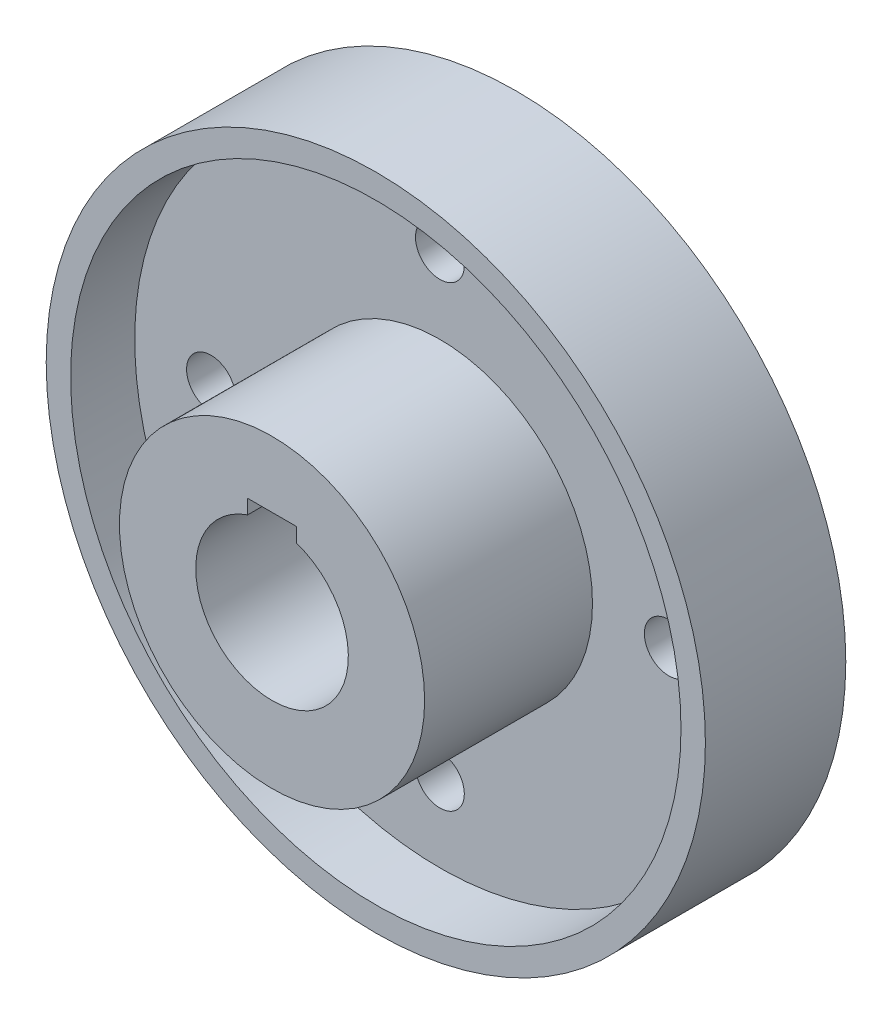
ISO-10303-21;
HEADER;
FILE_DESCRIPTION(('STEP AP214'),'2;1');
FILE_NAME('part.step','',(''),(''),'','','');
FILE_SCHEMA(('AUTOMOTIVE_DESIGN { 1 0 10303 214 1 1 1 1 }'));
ENDSEC;
DATA;
#1=APPLICATION_CONTEXT('core data for automotive mechanical design processes');
#2=APPLICATION_PROTOCOL_DEFINITION('international standard','automotive_design',2000,#1);
#3=PRODUCT_CONTEXT('',#1,'mechanical');
#4=PRODUCT('Part','Part','',(#3));
#5=PRODUCT_RELATED_PRODUCT_CATEGORY('part','',(#4));
#6=PRODUCT_DEFINITION_FORMATION('','',#4);
#7=PRODUCT_DEFINITION_CONTEXT('part definition',#1,'design');
#8=PRODUCT_DEFINITION('design','',#6,#7);
#9=PRODUCT_DEFINITION_SHAPE('','',#8);
#10=(LENGTH_UNIT() NAMED_UNIT(*) SI_UNIT(.MILLI.,.METRE.));
#11=(NAMED_UNIT(*) PLANE_ANGLE_UNIT() SI_UNIT($,.RADIAN.));
#12=(NAMED_UNIT(*) SI_UNIT($,.STERADIAN.) SOLID_ANGLE_UNIT());
#13=UNCERTAINTY_MEASURE_WITH_UNIT(LENGTH_MEASURE(1.E-05),#10,'distance_accuracy_value','');
#14=(GEOMETRIC_REPRESENTATION_CONTEXT(3) GLOBAL_UNCERTAINTY_ASSIGNED_CONTEXT((#13)) GLOBAL_UNIT_ASSIGNED_CONTEXT((#10,
#11,#12)) REPRESENTATION_CONTEXT('',''));
#15=CARTESIAN_POINT('',(0.,0.,0.));
#16=DIRECTION('',(0.,0.,1.));
#17=DIRECTION('',(1.,0.,0.));
#18=AXIS2_PLACEMENT_3D('',#15,#16,#17);
#19=CARTESIAN_POINT('',(0.,75.,46.));
#20=DIRECTION('',(0.,0.,-1.));
#21=DIRECTION('',(-1.,0.,0.));
#22=AXIS2_PLACEMENT_3D('',#19,#20,#21);
#23=CYLINDRICAL_SURFACE('',#22,8.);
#24=CARTESIAN_POINT('',(0.,75.,0.));
#25=DIRECTION('',(0.,0.,-1.));
#26=DIRECTION('',(-1.,0.,0.));
#27=AXIS2_PLACEMENT_3D('',#24,#25,#26);
#28=CIRCLE('',#27,8.);
#29=CARTESIAN_POINT('',(-8.,75.,0.));
#30=VERTEX_POINT('',#29);
#31=EDGE_CURVE('E121',#30,#30,#28,.T.);
#32=ORIENTED_EDGE('',*,*,#31,.T.);
#33=EDGE_LOOP('',(#32));
#34=FACE_BOUND('',#33,.T.);
#35=CARTESIAN_POINT('',(0.,75.,25.));
#36=DIRECTION('',(0.,0.,1.));
#37=DIRECTION('',(1.,0.,0.));
#38=AXIS2_PLACEMENT_3D('',#35,#36,#37);
#39=CIRCLE('',#38,8.);
#40=CARTESIAN_POINT('',(8.,75.,25.));
#41=VERTEX_POINT('',#40);
#42=EDGE_CURVE('E101',#41,#41,#39,.F.);
#43=ORIENTED_EDGE('',*,*,#42,.F.);
#44=EDGE_LOOP('',(#43));
#45=FACE_BOUND('',#44,.T.);
#46=ADVANCED_FACE('F45',(#34,#45),#23,.F.);
#47=CARTESIAN_POINT('',(-75.0000000000021,2.11785093078989E-12,46.));
#48=DIRECTION('',(0.,0.,-1.));
#49=DIRECTION('',(-1.,0.,0.));
#50=AXIS2_PLACEMENT_3D('',#47,#48,#49);
#51=CYLINDRICAL_SURFACE('',#50,8.00000000000166);
#52=CARTESIAN_POINT('',(-75.0000000000021,2.11785093078989E-12,0.));
#53=DIRECTION('',(0.,0.,-1.));
#54=DIRECTION('',(-1.,0.,0.));
#55=AXIS2_PLACEMENT_3D('',#52,#53,#54);
#56=CIRCLE('',#55,8.00000000000166);
#57=CARTESIAN_POINT('',(-83.0000000000038,2.11785093078989E-12,0.));
#58=VERTEX_POINT('',#57);
#59=EDGE_CURVE('E118',#58,#58,#56,.T.);
#60=ORIENTED_EDGE('',*,*,#59,.T.);
#61=EDGE_LOOP('',(#60));
#62=FACE_BOUND('',#61,.T.);
#63=CARTESIAN_POINT('',(-75.0000000000021,2.11785093078989E-12,25.));
#64=DIRECTION('',(0.,0.,1.));
#65=DIRECTION('',(1.,0.,0.));
#66=AXIS2_PLACEMENT_3D('',#63,#64,#65);
#67=CIRCLE('',#66,8.00000000000166);
#68=CARTESIAN_POINT('',(-67.0000000000005,2.11785093078989E-12,25.));
#69=VERTEX_POINT('',#68);
#70=EDGE_CURVE('E228',#69,#69,#67,.F.);
#71=ORIENTED_EDGE('',*,*,#70,.F.);
#72=EDGE_LOOP('',(#71));
#73=FACE_BOUND('',#72,.T.);
#74=ADVANCED_FACE('F166',(#62,#73),#51,.F.);
#75=CARTESIAN_POINT('',(-4.23570186157978E-12,-75.,46.));
#76=DIRECTION('',(0.,0.,-1.));
#77=DIRECTION('',(-1.,0.,0.));
#78=AXIS2_PLACEMENT_3D('',#75,#76,#77);
#79=CYLINDRICAL_SURFACE('',#78,8.00000000000455);
#80=CARTESIAN_POINT('',(-4.23570186157978E-12,-75.,0.));
#81=DIRECTION('',(0.,0.,-1.));
#82=DIRECTION('',(-1.,0.,0.));
#83=AXIS2_PLACEMENT_3D('',#80,#81,#82);
#84=CIRCLE('',#83,8.00000000000455);
#85=CARTESIAN_POINT('',(-8.00000000000879,-75.,0.));
#86=VERTEX_POINT('',#85);
#87=EDGE_CURVE('E115',#86,#86,#84,.T.);
#88=ORIENTED_EDGE('',*,*,#87,.T.);
#89=EDGE_LOOP('',(#88));
#90=FACE_BOUND('',#89,.T.);
#91=CARTESIAN_POINT('',(-4.23570186157978E-12,-75.,25.));
#92=DIRECTION('',(0.,0.,1.));
#93=DIRECTION('',(1.,0.,0.));
#94=AXIS2_PLACEMENT_3D('',#91,#92,#93);
#95=CIRCLE('',#94,8.00000000000455);
#96=CARTESIAN_POINT('',(8.00000000000032,-75.,25.));
#97=VERTEX_POINT('',#96);
#98=EDGE_CURVE('E225',#97,#97,#95,.F.);
#99=ORIENTED_EDGE('',*,*,#98,.F.);
#100=EDGE_LOOP('',(#99));
#101=FACE_BOUND('',#100,.T.);
#102=ADVANCED_FACE('F172',(#90,#101),#79,.F.);
#103=CARTESIAN_POINT('',(74.9999999999979,-2.1270357817835E-12,46.));
#104=DIRECTION('',(0.,0.,-1.));
#105=DIRECTION('',(-1.,0.,0.));
#106=AXIS2_PLACEMENT_3D('',#103,#104,#105);
#107=CYLINDRICAL_SURFACE('',#106,8.00000000000341);
#108=CARTESIAN_POINT('',(74.9999999999979,-2.1270357817835E-12,0.));
#109=DIRECTION('',(0.,0.,-1.));
#110=DIRECTION('',(-1.,0.,0.));
#111=AXIS2_PLACEMENT_3D('',#108,#109,#110);
#112=CIRCLE('',#111,8.00000000000341);
#113=CARTESIAN_POINT('',(66.9999999999945,-2.1270357817835E-12,0.));
#114=VERTEX_POINT('',#113);
#115=EDGE_CURVE('E112',#114,#114,#112,.T.);
#116=ORIENTED_EDGE('',*,*,#115,.T.);
#117=EDGE_LOOP('',(#116));
#118=FACE_BOUND('',#117,.T.);
#119=CARTESIAN_POINT('',(74.9999999999979,-2.1270357817835E-12,25.));
#120=DIRECTION('',(0.,0.,1.));
#121=DIRECTION('',(1.,0.,0.));
#122=AXIS2_PLACEMENT_3D('',#119,#120,#121);
#123=CIRCLE('',#122,8.00000000000341);
#124=CARTESIAN_POINT('',(83.0000000000013,-2.1270357817835E-12,25.));
#125=VERTEX_POINT('',#124);
#126=EDGE_CURVE('E50',#125,#125,#123,.F.);
#127=ORIENTED_EDGE('',*,*,#126,.F.);
#128=EDGE_LOOP('',(#127));
#129=FACE_BOUND('',#128,.T.);
#130=ADVANCED_FACE('F205',(#118,#129),#107,.F.);
#131=CARTESIAN_POINT('',(0.,0.,0.));
#132=DIRECTION('',(0.,0.,1.));
#133=DIRECTION('',(1.,0.,0.));
#134=AXIS2_PLACEMENT_3D('',#131,#132,#133);
#135=PLANE('',#134);
#136=CARTESIAN_POINT('',(0.,0.,0.));
#137=DIRECTION('',(0.,0.,-1.));
#138=DIRECTION('',(-1.,0.,0.));
#139=AXIS2_PLACEMENT_3D('',#136,#137,#138);
#140=CIRCLE('',#139,108.);
#141=CARTESIAN_POINT('',(-108.,0.,0.));
#142=VERTEX_POINT('',#141);
#143=EDGE_CURVE('E124',#142,#142,#140,.T.);
#144=ORIENTED_EDGE('',*,*,#143,.T.);
#145=EDGE_LOOP('',(#144));
#146=FACE_BOUND('',#145,.T.);
#147=ORIENTED_EDGE('',*,*,#31,.F.);
#148=EDGE_LOOP('',(#147));
#149=FACE_BOUND('',#148,.T.);
#150=ORIENTED_EDGE('',*,*,#59,.F.);
#151=EDGE_LOOP('',(#150));
#152=FACE_BOUND('',#151,.T.);
#153=ORIENTED_EDGE('',*,*,#87,.F.);
#154=EDGE_LOOP('',(#153));
#155=FACE_BOUND('',#154,.T.);
#156=ORIENTED_EDGE('',*,*,#115,.F.);
#157=EDGE_LOOP('',(#156));
#158=FACE_BOUND('',#157,.T.);
#159=CARTESIAN_POINT('',(0.,0.,0.));
#160=DIRECTION('',(0.,0.,1.));
#161=DIRECTION('',(1.,0.,0.));
#162=AXIS2_PLACEMENT_3D('',#159,#160,#161);
#163=CIRCLE('',#162,50.);
#164=CARTESIAN_POINT('',(50.,0.,0.));
#165=VERTEX_POINT('',#164);
#166=EDGE_CURVE('E144',#165,#165,#163,.F.);
#167=ORIENTED_EDGE('',*,*,#166,.F.);
#168=EDGE_LOOP('',(#167));
#169=FACE_BOUND('',#168,.T.);
#170=ADVANCED_FACE('F203',(#146,#149,#152,#155,#158,#169),#135,.F.);
#171=CARTESIAN_POINT('',(0.,0.,80.));
#172=DIRECTION('',(0.,0.,-1.));
#173=DIRECTION('',(-1.,0.,0.));
#174=AXIS2_PLACEMENT_3D('',#171,#172,#173);
#175=CYLINDRICAL_SURFACE('',#174,50.);
#176=CARTESIAN_POINT('',(0.,0.,80.));
#177=DIRECTION('',(0.,0.,1.));
#178=DIRECTION('',(1.,0.,0.));
#179=AXIS2_PLACEMENT_3D('',#176,#177,#178);
#180=CIRCLE('',#179,50.);
#181=CARTESIAN_POINT('',(50.,0.,80.));
#182=VERTEX_POINT('',#181);
#183=EDGE_CURVE('E141',#182,#182,#180,.T.);
#184=ORIENTED_EDGE('',*,*,#183,.F.);
#185=EDGE_LOOP('',(#184));
#186=FACE_BOUND('',#185,.T.);
#187=CARTESIAN_POINT('',(0.,0.,25.));
#188=DIRECTION('',(0.,0.,1.));
#189=DIRECTION('',(1.,0.,0.));
#190=AXIS2_PLACEMENT_3D('',#187,#188,#189);
#191=CIRCLE('',#190,50.);
#192=CARTESIAN_POINT('',(50.,0.,25.));
#193=VERTEX_POINT('',#192);
#194=EDGE_CURVE('E216',#193,#193,#191,.T.);
#195=ORIENTED_EDGE('',*,*,#194,.T.);
#196=EDGE_LOOP('',(#195));
#197=FACE_BOUND('',#196,.T.);
#198=ADVANCED_FACE('F201',(#186,#197),#175,.T.);
#199=CARTESIAN_POINT('',(0.,0.,80.));
#200=DIRECTION('',(0.,0.,1.));
#201=DIRECTION('',(1.,0.,0.));
#202=AXIS2_PLACEMENT_3D('',#199,#200,#201);
#203=PLANE('',#202);
#204=ORIENTED_EDGE('',*,*,#183,.T.);
#205=EDGE_LOOP('',(#204));
#206=FACE_BOUND('',#205,.T.);
#207=DIRECTION('',(0.,1.,0.));
#208=VECTOR('',#207,1.);
#209=CARTESIAN_POINT('',(8.,28.4,80.));
#210=LINE('',#209,#208);
#211=CARTESIAN_POINT('',(8.,23.685438564654,80.));
#212=VERTEX_POINT('',#211);
#213=CARTESIAN_POINT('',(8.,28.4,80.));
#214=VERTEX_POINT('',#213);
#215=EDGE_CURVE('E132',#212,#214,#210,.T.);
#216=ORIENTED_EDGE('',*,*,#215,.F.);
#217=CARTESIAN_POINT('',(0.,0.,80.));
#218=DIRECTION('',(0.,0.,1.));
#219=DIRECTION('',(1.,0.,0.));
#220=AXIS2_PLACEMENT_3D('',#217,#218,#219);
#221=CIRCLE('',#220,25.);
#222=CARTESIAN_POINT('',(-8.,23.685438564654,80.));
#223=VERTEX_POINT('',#222);
#224=EDGE_CURVE('E128',#223,#212,#221,.T.);
#225=ORIENTED_EDGE('',*,*,#224,.F.);
#226=DIRECTION('',(0.,-1.,0.));
#227=VECTOR('',#226,1.);
#228=CARTESIAN_POINT('',(-8.,28.4,80.));
#229=LINE('',#228,#227);
#230=CARTESIAN_POINT('',(-8.,28.4,80.));
#231=VERTEX_POINT('',#230);
#232=EDGE_CURVE('E67',#231,#223,#229,.T.);
#233=ORIENTED_EDGE('',*,*,#232,.F.);
#234=DIRECTION('',(-1.,0.,0.));
#235=VECTOR('',#234,1.);
#236=CARTESIAN_POINT('',(-8.,28.4,80.));
#237=LINE('',#236,#235);
#238=EDGE_CURVE('E134',#214,#231,#237,.T.);
#239=ORIENTED_EDGE('',*,*,#238,.F.);
#240=EDGE_LOOP('',(#216,#225,#233,#239));
#241=FACE_BOUND('',#240,.T.);
#242=ADVANCED_FACE('F198',(#206,#241),#203,.T.);
#243=CARTESIAN_POINT('',(0.,0.,80.));
#244=DIRECTION('',(0.,0.,-1.));
#245=DIRECTION('',(-1.,0.,0.));
#246=AXIS2_PLACEMENT_3D('',#243,#244,#245);
#247=CYLINDRICAL_SURFACE('',#246,25.);
#248=DIRECTION('',(0.,0.,-1.));
#249=VECTOR('',#248,1.);
#250=CARTESIAN_POINT('',(8.,23.685438564654,80.));
#251=LINE('',#250,#249);
#252=CARTESIAN_POINT('',(8.,23.685438564654,-5.));
#253=VERTEX_POINT('',#252);
#254=EDGE_CURVE('E97',#212,#253,#251,.T.);
#255=ORIENTED_EDGE('',*,*,#254,.T.);
#256=CARTESIAN_POINT('',(0.,0.,-5.));
#257=DIRECTION('',(0.,0.,-1.));
#258=DIRECTION('',(-1.,0.,0.));
#259=AXIS2_PLACEMENT_3D('',#256,#257,#258);
#260=CIRCLE('',#259,25.);
#261=CARTESIAN_POINT('',(-8.,23.685438564654,-5.));
#262=VERTEX_POINT('',#261);
#263=EDGE_CURVE('E94',#253,#262,#260,.T.);
#264=ORIENTED_EDGE('',*,*,#263,.T.);
#265=DIRECTION('',(0.,0.,-1.));
#266=VECTOR('',#265,1.);
#267=CARTESIAN_POINT('',(-8.,23.685438564654,80.));
#268=LINE('',#267,#266);
#269=EDGE_CURVE('E84',#223,#262,#268,.T.);
#270=ORIENTED_EDGE('',*,*,#269,.F.);
#271=ORIENTED_EDGE('',*,*,#224,.T.);
#272=EDGE_LOOP('',(#255,#264,#270,#271));
#273=FACE_BOUND('',#272,.T.);
#274=ADVANCED_FACE('F95',(#273),#247,.F.);
#275=CARTESIAN_POINT('',(8.,28.4,80.));
#276=DIRECTION('',(-1.,0.,0.));
#277=DIRECTION('',(0.,-1.,0.));
#278=AXIS2_PLACEMENT_3D('',#275,#276,#277);
#279=PLANE('',#278);
#280=DIRECTION('',(0.,0.,-1.));
#281=VECTOR('',#280,1.);
#282=CARTESIAN_POINT('',(8.,28.4,80.));
#283=LINE('',#282,#281);
#284=CARTESIAN_POINT('',(8.,28.4,-5.));
#285=VERTEX_POINT('',#284);
#286=EDGE_CURVE('E138',#214,#285,#283,.T.);
#287=ORIENTED_EDGE('',*,*,#286,.T.);
#288=DIRECTION('',(0.,-1.,0.));
#289=VECTOR('',#288,1.);
#290=CARTESIAN_POINT('',(8.,23.685438564654,-5.));
#291=LINE('',#290,#289);
#292=EDGE_CURVE('E107',#285,#253,#291,.T.);
#293=ORIENTED_EDGE('',*,*,#292,.T.);
#294=ORIENTED_EDGE('',*,*,#254,.F.);
#295=ORIENTED_EDGE('',*,*,#215,.T.);
#296=EDGE_LOOP('',(#287,#293,#294,#295));
#297=FACE_BOUND('',#296,.T.);
#298=ADVANCED_FACE('F191',(#297),#279,.T.);
#299=CARTESIAN_POINT('',(-8.,28.4,80.));
#300=DIRECTION('',(0.,-1.,0.));
#301=DIRECTION('',(0.,0.,-1.));
#302=AXIS2_PLACEMENT_3D('',#299,#300,#301);
#303=PLANE('',#302);
#304=DIRECTION('',(0.,0.,-1.));
#305=VECTOR('',#304,1.);
#306=CARTESIAN_POINT('',(-8.,28.4,80.));
#307=LINE('',#306,#305);
#308=CARTESIAN_POINT('',(-8.,28.4,-5.));
#309=VERTEX_POINT('',#308);
#310=EDGE_CURVE('E62',#231,#309,#307,.T.);
#311=ORIENTED_EDGE('',*,*,#310,.T.);
#312=DIRECTION('',(1.,0.,0.));
#313=VECTOR('',#312,1.);
#314=CARTESIAN_POINT('',(8.,28.4,-5.));
#315=LINE('',#314,#313);
#316=EDGE_CURVE('E105',#309,#285,#315,.T.);
#317=ORIENTED_EDGE('',*,*,#316,.T.);
#318=ORIENTED_EDGE('',*,*,#286,.F.);
#319=ORIENTED_EDGE('',*,*,#238,.T.);
#320=EDGE_LOOP('',(#311,#317,#318,#319));
#321=FACE_BOUND('',#320,.T.);
#322=ADVANCED_FACE('F188',(#321),#303,.T.);
#323=CARTESIAN_POINT('',(-8.,28.4,80.));
#324=DIRECTION('',(1.,0.,0.));
#325=DIRECTION('',(0.,0.,-1.));
#326=AXIS2_PLACEMENT_3D('',#323,#324,#325);
#327=PLANE('',#326);
#328=ORIENTED_EDGE('',*,*,#269,.T.);
#329=DIRECTION('',(0.,1.,0.));
#330=VECTOR('',#329,1.);
#331=CARTESIAN_POINT('',(-8.,28.4,-5.));
#332=LINE('',#331,#330);
#333=EDGE_CURVE('E88',#262,#309,#332,.T.);
#334=ORIENTED_EDGE('',*,*,#333,.T.);
#335=ORIENTED_EDGE('',*,*,#310,.F.);
#336=ORIENTED_EDGE('',*,*,#232,.T.);
#337=EDGE_LOOP('',(#328,#334,#335,#336));
#338=FACE_BOUND('',#337,.T.);
#339=ADVANCED_FACE('F86',(#338),#327,.T.);
#340=CARTESIAN_POINT('',(0.,0.,46.));
#341=DIRECTION('',(0.,0.,-1.));
#342=DIRECTION('',(-1.,0.,0.));
#343=AXIS2_PLACEMENT_3D('',#340,#341,#342);
#344=CYLINDRICAL_SURFACE('',#343,108.);
#345=CARTESIAN_POINT('',(0.,0.,46.));
#346=DIRECTION('',(0.,0.,-1.));
#347=DIRECTION('',(-1.,0.,0.));
#348=AXIS2_PLACEMENT_3D('',#345,#346,#347);
#349=CIRCLE('',#348,108.);
#350=CARTESIAN_POINT('',(-108.,0.,46.));
#351=VERTEX_POINT('',#350);
#352=EDGE_CURVE('E125',#351,#351,#349,.T.);
#353=ORIENTED_EDGE('',*,*,#352,.T.);
#354=EDGE_LOOP('',(#353));
#355=FACE_BOUND('',#354,.T.);
#356=ORIENTED_EDGE('',*,*,#143,.F.);
#357=EDGE_LOOP('',(#356));
#358=FACE_BOUND('',#357,.T.);
#359=ADVANCED_FACE('F181',(#355,#358),#344,.T.);
#360=CARTESIAN_POINT('',(0.,0.,46.));
#361=DIRECTION('',(0.,0.,-1.));
#362=DIRECTION('',(-1.,0.,0.));
#363=AXIS2_PLACEMENT_3D('',#360,#361,#362);
#364=PLANE('',#363);
#365=CARTESIAN_POINT('',(0.,0.,46.));
#366=DIRECTION('',(0.,0.,1.));
#367=DIRECTION('',(1.,0.,0.));
#368=AXIS2_PLACEMENT_3D('',#365,#366,#367);
#369=CIRCLE('',#368,100.);
#370=CARTESIAN_POINT('',(100.,0.,46.));
#371=VERTEX_POINT('',#370);
#372=EDGE_CURVE('E217',#371,#371,#369,.T.);
#373=ORIENTED_EDGE('',*,*,#372,.F.);
#374=EDGE_LOOP('',(#373));
#375=FACE_BOUND('',#374,.T.);
#376=ORIENTED_EDGE('',*,*,#352,.F.);
#377=EDGE_LOOP('',(#376));
#378=FACE_BOUND('',#377,.T.);
#379=ADVANCED_FACE('F178',(#375,#378),#364,.F.);
#380=CARTESIAN_POINT('',(0.,0.,-5.));
#381=DIRECTION('',(0.,0.,-1.));
#382=DIRECTION('',(-1.,0.,0.));
#383=AXIS2_PLACEMENT_3D('',#380,#381,#382);
#384=PLANE('',#383);
#385=CARTESIAN_POINT('',(0.,0.,-5.));
#386=DIRECTION('',(0.,0.,-1.));
#387=DIRECTION('',(-1.,0.,0.));
#388=AXIS2_PLACEMENT_3D('',#385,#386,#387);
#389=CIRCLE('',#388,48.0000000000001);
#390=CARTESIAN_POINT('',(-48.0000000000001,0.,-5.));
#391=VERTEX_POINT('',#390);
#392=EDGE_CURVE('E55',#391,#391,#389,.T.);
#393=ORIENTED_EDGE('',*,*,#392,.T.);
#394=EDGE_LOOP('',(#393));
#395=FACE_BOUND('',#394,.T.);
#396=ORIENTED_EDGE('',*,*,#333,.F.);
#397=ORIENTED_EDGE('',*,*,#263,.F.);
#398=ORIENTED_EDGE('',*,*,#292,.F.);
#399=ORIENTED_EDGE('',*,*,#316,.F.);
#400=EDGE_LOOP('',(#396,#397,#398,#399));
#401=FACE_BOUND('',#400,.T.);
#402=ADVANCED_FACE('F103',(#395,#401),#384,.T.);
#403=CARTESIAN_POINT('',(0.,0.,-5.));
#404=DIRECTION('',(0.,0.,1.));
#405=DIRECTION('',(1.,0.,0.));
#406=AXIS2_PLACEMENT_3D('',#403,#404,#405);
#407=CYLINDRICAL_SURFACE('',#406,50.);
#408=CARTESIAN_POINT('',(0.,0.,-3.00000000000006));
#409=DIRECTION('',(0.,0.,-1.));
#410=DIRECTION('',(-1.,0.,0.));
#411=AXIS2_PLACEMENT_3D('',#408,#409,#410);
#412=CIRCLE('',#411,50.);
#413=CARTESIAN_POINT('',(-50.,0.,-3.00000000000006));
#414=VERTEX_POINT('',#413);
#415=EDGE_CURVE('E11',#414,#414,#412,.F.);
#416=ORIENTED_EDGE('',*,*,#415,.T.);
#417=EDGE_LOOP('',(#416));
#418=FACE_BOUND('',#417,.T.);
#419=ORIENTED_EDGE('',*,*,#166,.T.);
#420=EDGE_LOOP('',(#419));
#421=FACE_BOUND('',#420,.T.);
#422=ADVANCED_FACE('F153',(#418,#421),#407,.T.);
#423=CARTESIAN_POINT('',(0.,0.,-5.));
#424=DIRECTION('',(0.,0.,1.));
#425=DIRECTION('',(1.,0.,0.));
#426=AXIS2_PLACEMENT_3D('',#423,#424,#425);
#427=CONICAL_SURFACE('',#426,48.0000000000001,0.785398163397447);
#428=ORIENTED_EDGE('',*,*,#415,.F.);
#429=EDGE_LOOP('',(#428));
#430=FACE_BOUND('',#429,.T.);
#431=ORIENTED_EDGE('',*,*,#392,.F.);
#432=EDGE_LOOP('',(#431));
#433=FACE_BOUND('',#432,.T.);
#434=ADVANCED_FACE('F48',(#430,#433),#427,.T.);
#435=CARTESIAN_POINT('',(0.,0.,25.));
#436=DIRECTION('',(0.,0.,1.));
#437=DIRECTION('',(1.,0.,0.));
#438=AXIS2_PLACEMENT_3D('',#435,#436,#437);
#439=PLANE('',#438);
#440=ORIENTED_EDGE('',*,*,#194,.F.);
#441=EDGE_LOOP('',(#440));
#442=FACE_BOUND('',#441,.T.);
#443=CARTESIAN_POINT('',(0.,0.,25.));
#444=DIRECTION('',(0.,0.,1.));
#445=DIRECTION('',(1.,0.,0.));
#446=AXIS2_PLACEMENT_3D('',#443,#444,#445);
#447=CIRCLE('',#446,100.);
#448=CARTESIAN_POINT('',(100.,0.,25.));
#449=VERTEX_POINT('',#448);
#450=EDGE_CURVE('E220',#449,#449,#447,.T.);
#451=ORIENTED_EDGE('',*,*,#450,.T.);
#452=EDGE_LOOP('',(#451));
#453=FACE_BOUND('',#452,.T.);
#454=ORIENTED_EDGE('',*,*,#126,.T.);
#455=EDGE_LOOP('',(#454));
#456=FACE_BOUND('',#455,.T.);
#457=ORIENTED_EDGE('',*,*,#98,.T.);
#458=EDGE_LOOP('',(#457));
#459=FACE_BOUND('',#458,.T.);
#460=ORIENTED_EDGE('',*,*,#70,.T.);
#461=EDGE_LOOP('',(#460));
#462=FACE_BOUND('',#461,.T.);
#463=ORIENTED_EDGE('',*,*,#42,.T.);
#464=EDGE_LOOP('',(#463));
#465=FACE_BOUND('',#464,.T.);
#466=ADVANCED_FACE('F152',(#442,#453,#456,#459,#462,#465),#439,.T.);
#467=CARTESIAN_POINT('',(0.,0.,25.));
#468=DIRECTION('',(0.,0.,1.));
#469=DIRECTION('',(1.,0.,0.));
#470=AXIS2_PLACEMENT_3D('',#467,#468,#469);
#471=CYLINDRICAL_SURFACE('',#470,100.);
#472=CARTESIAN_POINT('',(100.,0.,25.));
#473=CARTESIAN_POINT('',(100.,0.,25.21875));
#474=CARTESIAN_POINT('',(100.,0.,25.4375));
#475=CARTESIAN_POINT('',(100.,0.,25.875));
#476=CARTESIAN_POINT('',(100.,0.,26.09375));
#477=CARTESIAN_POINT('',(100.,0.,26.53125));
#478=CARTESIAN_POINT('',(100.,0.,26.75));
#479=CARTESIAN_POINT('',(100.,0.,27.1875));
#480=CARTESIAN_POINT('',(100.,0.,27.40625));
#481=CARTESIAN_POINT('',(100.,0.,27.84375));
#482=CARTESIAN_POINT('',(100.,0.,28.0625));
#483=CARTESIAN_POINT('',(100.,0.,28.5));
#484=CARTESIAN_POINT('',(100.,0.,28.71875));
#485=CARTESIAN_POINT('',(100.,0.,29.15625));
#486=CARTESIAN_POINT('',(100.,0.,29.375));
#487=CARTESIAN_POINT('',(100.,0.,29.8125));
#488=CARTESIAN_POINT('',(100.,0.,30.03125));
#489=CARTESIAN_POINT('',(100.,0.,30.46875));
#490=CARTESIAN_POINT('',(100.,0.,30.6875));
#491=CARTESIAN_POINT('',(100.,0.,31.125));
#492=CARTESIAN_POINT('',(100.,0.,31.34375));
#493=CARTESIAN_POINT('',(100.,0.,31.78125));
#494=CARTESIAN_POINT('',(100.,0.,32.));
#495=CARTESIAN_POINT('',(100.,0.,32.4375));
#496=CARTESIAN_POINT('',(100.,0.,32.65625));
#497=CARTESIAN_POINT('',(100.,0.,33.09375));
#498=CARTESIAN_POINT('',(100.,0.,33.3125));
#499=CARTESIAN_POINT('',(100.,0.,33.75));
#500=CARTESIAN_POINT('',(100.,0.,33.96875));
#501=CARTESIAN_POINT('',(100.,0.,34.40625));
#502=CARTESIAN_POINT('',(100.,0.,34.625));
#503=CARTESIAN_POINT('',(100.,0.,35.0625));
#504=CARTESIAN_POINT('',(100.,0.,35.28125));
#505=CARTESIAN_POINT('',(100.,0.,35.71875));
#506=CARTESIAN_POINT('',(100.,0.,35.9375));
#507=CARTESIAN_POINT('',(100.,0.,36.375));
#508=CARTESIAN_POINT('',(100.,0.,36.59375));
#509=CARTESIAN_POINT('',(100.,0.,37.03125));
#510=CARTESIAN_POINT('',(100.,0.,37.25));
#511=CARTESIAN_POINT('',(100.,0.,37.6875));
#512=CARTESIAN_POINT('',(100.,0.,37.90625));
#513=CARTESIAN_POINT('',(100.,0.,38.34375));
#514=CARTESIAN_POINT('',(100.,0.,38.5625));
#515=CARTESIAN_POINT('',(100.,0.,39.));
#516=CARTESIAN_POINT('',(100.,0.,39.21875));
#517=CARTESIAN_POINT('',(100.,0.,39.65625));
#518=CARTESIAN_POINT('',(100.,0.,39.875));
#519=CARTESIAN_POINT('',(100.,0.,40.3125));
#520=CARTESIAN_POINT('',(100.,0.,40.53125));
#521=CARTESIAN_POINT('',(100.,0.,40.96875));
#522=CARTESIAN_POINT('',(100.,0.,41.1875));
#523=CARTESIAN_POINT('',(100.,0.,41.625));
#524=CARTESIAN_POINT('',(100.,0.,41.84375));
#525=CARTESIAN_POINT('',(100.,0.,42.28125));
#526=CARTESIAN_POINT('',(100.,0.,42.5));
#527=CARTESIAN_POINT('',(100.,0.,42.9375));
#528=CARTESIAN_POINT('',(100.,0.,43.15625));
#529=CARTESIAN_POINT('',(100.,0.,43.59375));
#530=CARTESIAN_POINT('',(100.,0.,43.8125));
#531=CARTESIAN_POINT('',(100.,0.,44.25));
#532=CARTESIAN_POINT('',(100.,0.,44.46875));
#533=CARTESIAN_POINT('',(100.,0.,44.90625));
#534=CARTESIAN_POINT('',(100.,0.,45.125));
#535=CARTESIAN_POINT('',(100.,0.,45.5625));
#536=CARTESIAN_POINT('',(100.,0.,45.78125));
#537=CARTESIAN_POINT('',(100.,0.,46.));
#538=B_SPLINE_CURVE_WITH_KNOTS('',3,(#472,#473,#474,#475,#476,#477,#478,#479,#480,#481,#482,
#483,#484,#485,#486,#487,#488,#489,#490,#491,#492,#493,#494,#495,#496,#497,#498,#499,#500,#501,
#502,#503,#504,#505,#506,#507,#508,#509,#510,#511,#512,#513,#514,#515,#516,#517,#518,#519,#520,
#521,#522,#523,#524,#525,#526,#527,#528,#529,#530,#531,#532,#533,#534,#535,#536,#537),
.UNSPECIFIED.,.F.,.F.,(4,2,2,2,2,2,2,2,2,2,2,2,2,2,2,2,2,2,2,2,2,2,2,2,2,2,2,2,2,2,2,2,4),(0.,
0.656250000000001,1.3125,1.96875,2.625,3.28125,3.9375,4.59375,5.25,5.90625,6.5625,7.21875,7.875,
8.53125,9.1875,9.84375,10.5,11.15625,11.8125,12.46875,13.125,13.78125,14.4375,15.09375,15.75,
16.40625,17.0625,17.71875,18.375,19.03125,19.6875,20.34375,21.),.UNSPECIFIED.);
#539=EDGE_CURVE('BSEAM159',#449,#371,#538,.T.);
#540=ORIENTED_EDGE('',*,*,#450,.F.);
#541=ORIENTED_EDGE('',*,*,#372,.T.);
#542=ORIENTED_EDGE('',*,*,#539,.T.);
#543=ORIENTED_EDGE('',*,*,#539,.F.);
#544=EDGE_LOOP('',(#540,#542,#541,#543));
#545=FACE_BOUND('',#544,.T.);
#546=ADVANCED_FACE('F159',(#545),#471,.F.);
#547=CLOSED_SHELL('',(#46,#74,#102,#130,#170,#198,#242,#274,#298,#322,#339,#359,#379,#402,#422,
#434,#466,#546));
#548=MANIFOLD_SOLID_BREP('B2',#547);
#549=ADVANCED_BREP_SHAPE_REPRESENTATION('',(#18,#548),#14);
#550=SHAPE_DEFINITION_REPRESENTATION(#9,#549);
ENDSEC;
END-ISO-10303-21;
